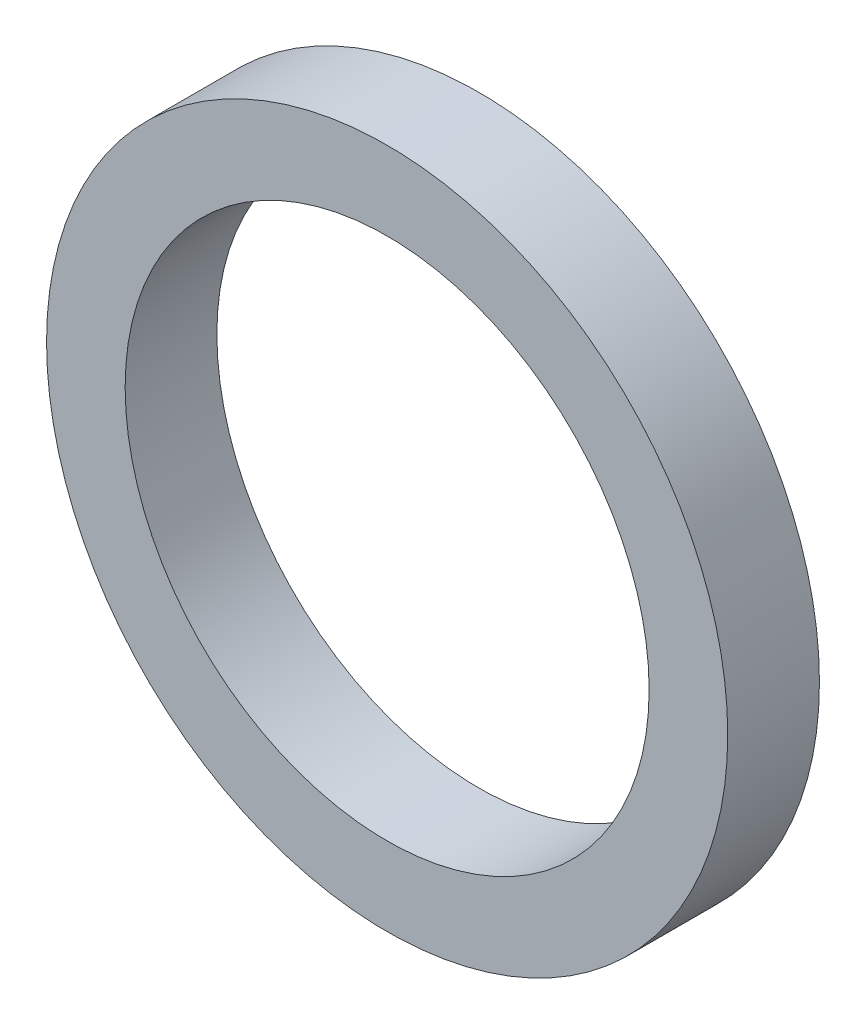
ISO-10303-21;
HEADER;
FILE_DESCRIPTION(('STEP AP214'),'2;1');
FILE_NAME('part.step','',(''),(''),'','','');
FILE_SCHEMA(('AUTOMOTIVE_DESIGN { 1 0 10303 214 1 1 1 1 }'));
ENDSEC;
DATA;
#1=APPLICATION_CONTEXT('core data for automotive mechanical design processes');
#2=APPLICATION_PROTOCOL_DEFINITION('international standard','automotive_design',2000,#1);
#3=PRODUCT_CONTEXT('',#1,'mechanical');
#4=PRODUCT('Part','Part','',(#3));
#5=PRODUCT_RELATED_PRODUCT_CATEGORY('part','',(#4));
#6=PRODUCT_DEFINITION_FORMATION('','',#4);
#7=PRODUCT_DEFINITION_CONTEXT('part definition',#1,'design');
#8=PRODUCT_DEFINITION('design','',#6,#7);
#9=PRODUCT_DEFINITION_SHAPE('','',#8);
#10=(LENGTH_UNIT() NAMED_UNIT(*) SI_UNIT(.MILLI.,.METRE.));
#11=(NAMED_UNIT(*) PLANE_ANGLE_UNIT() SI_UNIT($,.RADIAN.));
#12=(NAMED_UNIT(*) SI_UNIT($,.STERADIAN.) SOLID_ANGLE_UNIT());
#13=UNCERTAINTY_MEASURE_WITH_UNIT(LENGTH_MEASURE(1.E-05),#10,'distance_accuracy_value','');
#14=(GEOMETRIC_REPRESENTATION_CONTEXT(3) GLOBAL_UNCERTAINTY_ASSIGNED_CONTEXT((#13)) GLOBAL_UNIT_ASSIGNED_CONTEXT((#10,
#11,#12)) REPRESENTATION_CONTEXT('',''));
#15=CARTESIAN_POINT('',(0.,0.,0.));
#16=DIRECTION('',(0.,0.,1.));
#17=DIRECTION('',(1.,0.,0.));
#18=AXIS2_PLACEMENT_3D('',#15,#16,#17);
#19=CARTESIAN_POINT('',(0.,0.,7.));
#20=DIRECTION('',(0.,0.,1.));
#21=DIRECTION('',(1.,0.,0.));
#22=AXIS2_PLACEMENT_3D('',#19,#20,#21);
#23=PLANE('',#22);
#24=CARTESIAN_POINT('',(0.,0.,7.));
#25=DIRECTION('',(0.,0.,1.));
#26=DIRECTION('',(1.,0.,0.));
#27=AXIS2_PLACEMENT_3D('',#24,#25,#26);
#28=CIRCLE('',#27,26.);
#29=CARTESIAN_POINT('',(26.,0.,7.));
#30=VERTEX_POINT('',#29);
#31=EDGE_CURVE('E10',#30,#30,#28,.T.);
#32=ORIENTED_EDGE('',*,*,#31,.T.);
#33=EDGE_LOOP('',(#32));
#34=FACE_BOUND('',#33,.T.);
#35=CARTESIAN_POINT('',(0.,0.,7.));
#36=DIRECTION('',(0.,0.,1.));
#37=DIRECTION('',(1.,0.,0.));
#38=AXIS2_PLACEMENT_3D('',#35,#36,#37);
#39=CIRCLE('',#38,20.);
#40=CARTESIAN_POINT('',(20.,0.,7.));
#41=VERTEX_POINT('',#40);
#42=EDGE_CURVE('E48',#41,#41,#39,.T.);
#43=ORIENTED_EDGE('',*,*,#42,.F.);
#44=EDGE_LOOP('',(#43));
#45=FACE_BOUND('',#44,.T.);
#46=ADVANCED_FACE('F40',(#34,#45),#23,.T.);
#47=CARTESIAN_POINT('',(0.,0.,0.));
#48=DIRECTION('',(0.,0.,1.));
#49=DIRECTION('',(1.,0.,0.));
#50=AXIS2_PLACEMENT_3D('',#47,#48,#49);
#51=PLANE('',#50);
#52=CARTESIAN_POINT('',(0.,0.,0.));
#53=DIRECTION('',(0.,0.,1.));
#54=DIRECTION('',(1.,0.,0.));
#55=AXIS2_PLACEMENT_3D('',#52,#53,#54);
#56=CIRCLE('',#55,26.);
#57=CARTESIAN_POINT('',(26.,0.,0.));
#58=VERTEX_POINT('',#57);
#59=EDGE_CURVE('E41',#58,#58,#56,.T.);
#60=ORIENTED_EDGE('',*,*,#59,.F.);
#61=EDGE_LOOP('',(#60));
#62=FACE_BOUND('',#61,.T.);
#63=CARTESIAN_POINT('',(0.,0.,0.));
#64=DIRECTION('',(0.,0.,1.));
#65=DIRECTION('',(1.,0.,0.));
#66=AXIS2_PLACEMENT_3D('',#63,#64,#65);
#67=CIRCLE('',#66,20.);
#68=CARTESIAN_POINT('',(20.,0.,0.));
#69=VERTEX_POINT('',#68);
#70=EDGE_CURVE('E49',#69,#69,#67,.T.);
#71=ORIENTED_EDGE('',*,*,#70,.T.);
#72=EDGE_LOOP('',(#71));
#73=FACE_BOUND('',#72,.T.);
#74=ADVANCED_FACE('F58',(#62,#73),#51,.F.);
#75=CARTESIAN_POINT('',(0.,0.,7.));
#76=DIRECTION('',(0.,0.,-1.));
#77=DIRECTION('',(-1.,0.,0.));
#78=AXIS2_PLACEMENT_3D('',#75,#76,#77);
#79=CYLINDRICAL_SURFACE('',#78,26.);
#80=ORIENTED_EDGE('',*,*,#31,.F.);
#81=EDGE_LOOP('',(#80));
#82=FACE_BOUND('',#81,.T.);
#83=ORIENTED_EDGE('',*,*,#59,.T.);
#84=EDGE_LOOP('',(#83));
#85=FACE_BOUND('',#84,.T.);
#86=ADVANCED_FACE('F39',(#82,#85),#79,.T.);
#87=CARTESIAN_POINT('',(0.,0.,7.));
#88=DIRECTION('',(0.,0.,-1.));
#89=DIRECTION('',(-1.,0.,0.));
#90=AXIS2_PLACEMENT_3D('',#87,#88,#89);
#91=CYLINDRICAL_SURFACE('',#90,20.);
#92=ORIENTED_EDGE('',*,*,#42,.T.);
#93=EDGE_LOOP('',(#92));
#94=FACE_BOUND('',#93,.T.);
#95=ORIENTED_EDGE('',*,*,#70,.F.);
#96=EDGE_LOOP('',(#95));
#97=FACE_BOUND('',#96,.T.);
#98=ADVANCED_FACE('F57',(#94,#97),#91,.F.);
#99=CLOSED_SHELL('',(#46,#74,#86,#98));
#100=MANIFOLD_SOLID_BREP('B2',#99);
#101=ADVANCED_BREP_SHAPE_REPRESENTATION('',(#18,#100),#14);
#102=SHAPE_DEFINITION_REPRESENTATION(#9,#101);
ENDSEC;
END-ISO-10303-21;
